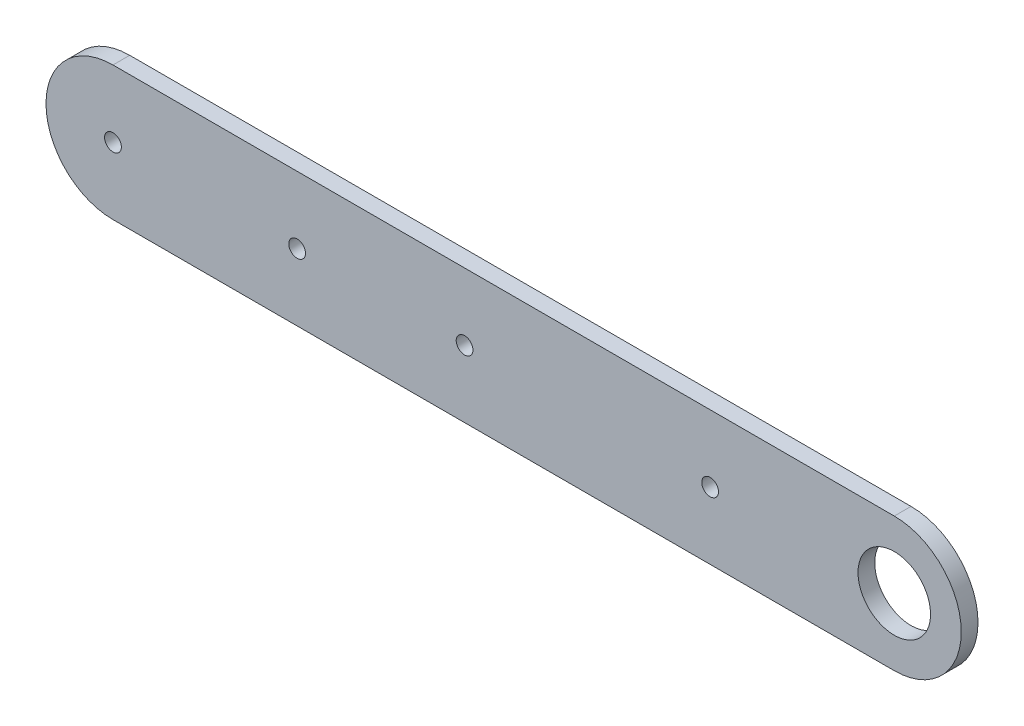
ISO-10303-21;
HEADER;
FILE_DESCRIPTION(('STEP AP214'),'2;1');
FILE_NAME('part.step','',(''),(''),'','','');
FILE_SCHEMA(('AUTOMOTIVE_DESIGN { 1 0 10303 214 1 1 1 1 }'));
ENDSEC;
DATA;
#1=APPLICATION_CONTEXT('core data for automotive mechanical design processes');
#2=APPLICATION_PROTOCOL_DEFINITION('international standard','automotive_design',2000,#1);
#3=PRODUCT_CONTEXT('',#1,'mechanical');
#4=PRODUCT('Part','Part','',(#3));
#5=PRODUCT_RELATED_PRODUCT_CATEGORY('part','',(#4));
#6=PRODUCT_DEFINITION_FORMATION('','',#4);
#7=PRODUCT_DEFINITION_CONTEXT('part definition',#1,'design');
#8=PRODUCT_DEFINITION('design','',#6,#7);
#9=PRODUCT_DEFINITION_SHAPE('','',#8);
#10=(LENGTH_UNIT() NAMED_UNIT(*) SI_UNIT(.MILLI.,.METRE.));
#11=(NAMED_UNIT(*) PLANE_ANGLE_UNIT() SI_UNIT($,.RADIAN.));
#12=(NAMED_UNIT(*) SI_UNIT($,.STERADIAN.) SOLID_ANGLE_UNIT());
#13=UNCERTAINTY_MEASURE_WITH_UNIT(LENGTH_MEASURE(1.E-05),#10,'distance_accuracy_value','');
#14=(GEOMETRIC_REPRESENTATION_CONTEXT(3) GLOBAL_UNCERTAINTY_ASSIGNED_CONTEXT((#13)) GLOBAL_UNIT_ASSIGNED_CONTEXT((#10,
#11,#12)) REPRESENTATION_CONTEXT('',''));
#15=CARTESIAN_POINT('',(0.,0.,0.));
#16=DIRECTION('',(0.,0.,1.));
#17=DIRECTION('',(1.,0.,0.));
#18=AXIS2_PLACEMENT_3D('',#15,#16,#17);
#19=CARTESIAN_POINT('',(-70.,0.,3.));
#20=DIRECTION('',(0.,0.,1.));
#21=DIRECTION('',(1.,0.,0.));
#22=AXIS2_PLACEMENT_3D('',#19,#20,#21);
#23=PLANE('',#22);
#24=CARTESIAN_POINT('',(-37.,0.,3.));
#25=DIRECTION('',(0.,0.,1.));
#26=DIRECTION('',(1.,0.,0.));
#27=AXIS2_PLACEMENT_3D('',#24,#25,#26);
#28=CIRCLE('',#27,1.5);
#29=CARTESIAN_POINT('',(-35.5,0.,3.));
#30=VERTEX_POINT('',#29);
#31=EDGE_CURVE('E127',#30,#30,#28,.T.);
#32=ORIENTED_EDGE('',*,*,#31,.F.);
#33=EDGE_LOOP('',(#32));
#34=FACE_BOUND('',#33,.T.);
#35=CARTESIAN_POINT('',(70.,0.,3.));
#36=DIRECTION('',(0.,0.,1.));
#37=DIRECTION('',(-1.,0.,0.));
#38=AXIS2_PLACEMENT_3D('',#35,#36,#37);
#39=CIRCLE('',#38,6.5);
#40=CARTESIAN_POINT('',(63.5,0.,3.));
#41=VERTEX_POINT('',#40);
#42=EDGE_CURVE('E115',#41,#41,#39,.T.);
#43=ORIENTED_EDGE('',*,*,#42,.F.);
#44=EDGE_LOOP('',(#43));
#45=FACE_BOUND('',#44,.T.);
#46=CARTESIAN_POINT('',(-70.,0.,3.));
#47=DIRECTION('',(0.,0.,1.));
#48=DIRECTION('',(1.,0.,0.));
#49=AXIS2_PLACEMENT_3D('',#46,#47,#48);
#50=CIRCLE('',#49,12.);
#51=CARTESIAN_POINT('',(-70.,12.,3.));
#52=VERTEX_POINT('',#51);
#53=CARTESIAN_POINT('',(-70.,-12.,3.));
#54=VERTEX_POINT('',#53);
#55=EDGE_CURVE('E85',#52,#54,#50,.T.);
#56=ORIENTED_EDGE('',*,*,#55,.T.);
#57=DIRECTION('',(1.,0.,0.));
#58=VECTOR('',#57,1.);
#59=CARTESIAN_POINT('',(-70.,-12.,3.));
#60=LINE('',#59,#58);
#61=CARTESIAN_POINT('',(70.,-12.,3.));
#62=VERTEX_POINT('',#61);
#63=EDGE_CURVE('E80',#54,#62,#60,.T.);
#64=ORIENTED_EDGE('',*,*,#63,.T.);
#65=CARTESIAN_POINT('',(70.,0.,3.));
#66=DIRECTION('',(0.,0.,1.));
#67=DIRECTION('',(-1.,0.,0.));
#68=AXIS2_PLACEMENT_3D('',#65,#66,#67);
#69=CIRCLE('',#68,12.);
#70=CARTESIAN_POINT('',(70.,12.,3.));
#71=VERTEX_POINT('',#70);
#72=EDGE_CURVE('E83',#62,#71,#69,.T.);
#73=ORIENTED_EDGE('',*,*,#72,.T.);
#74=DIRECTION('',(-1.,0.,0.));
#75=VECTOR('',#74,1.);
#76=CARTESIAN_POINT('',(-70.,12.,3.));
#77=LINE('',#76,#75);
#78=EDGE_CURVE('E50',#71,#52,#77,.T.);
#79=ORIENTED_EDGE('',*,*,#78,.T.);
#80=EDGE_LOOP('',(#56,#64,#73,#79));
#81=FACE_BOUND('',#80,.T.);
#82=CARTESIAN_POINT('',(-70.,0.,3.));
#83=DIRECTION('',(0.,0.,1.));
#84=DIRECTION('',(1.,0.,0.));
#85=AXIS2_PLACEMENT_3D('',#82,#83,#84);
#86=CIRCLE('',#85,1.5);
#87=CARTESIAN_POINT('',(-68.5,0.,3.));
#88=VERTEX_POINT('',#87);
#89=EDGE_CURVE('E100',#88,#88,#86,.T.);
#90=ORIENTED_EDGE('',*,*,#89,.F.);
#91=EDGE_LOOP('',(#90));
#92=FACE_BOUND('',#91,.T.);
#93=CARTESIAN_POINT('',(-7.,0.,3.));
#94=DIRECTION('',(0.,0.,1.));
#95=DIRECTION('',(1.,0.,0.));
#96=AXIS2_PLACEMENT_3D('',#93,#94,#95);
#97=CIRCLE('',#96,1.5);
#98=CARTESIAN_POINT('',(-5.5,0.,3.));
#99=VERTEX_POINT('',#98);
#100=EDGE_CURVE('E121',#99,#99,#97,.T.);
#101=ORIENTED_EDGE('',*,*,#100,.F.);
#102=EDGE_LOOP('',(#101));
#103=FACE_BOUND('',#102,.T.);
#104=CARTESIAN_POINT('',(37.,0.,3.));
#105=DIRECTION('',(0.,0.,1.));
#106=DIRECTION('',(1.,0.,0.));
#107=AXIS2_PLACEMENT_3D('',#104,#105,#106);
#108=CIRCLE('',#107,1.5);
#109=CARTESIAN_POINT('',(38.5,0.,3.));
#110=VERTEX_POINT('',#109);
#111=EDGE_CURVE('E133',#110,#110,#108,.T.);
#112=ORIENTED_EDGE('',*,*,#111,.F.);
#113=EDGE_LOOP('',(#112));
#114=FACE_BOUND('',#113,.T.);
#115=ADVANCED_FACE('F33',(#34,#45,#81,#92,#103,#114),#23,.T.);
#116=CARTESIAN_POINT('',(-70.,0.,0.));
#117=DIRECTION('',(0.,0.,1.));
#118=DIRECTION('',(1.,0.,0.));
#119=AXIS2_PLACEMENT_3D('',#116,#117,#118);
#120=PLANE('',#119);
#121=CARTESIAN_POINT('',(-70.,0.,0.));
#122=DIRECTION('',(0.,0.,1.));
#123=DIRECTION('',(1.,0.,0.));
#124=AXIS2_PLACEMENT_3D('',#121,#122,#123);
#125=CIRCLE('',#124,12.);
#126=CARTESIAN_POINT('',(-70.,12.,0.));
#127=VERTEX_POINT('',#126);
#128=CARTESIAN_POINT('',(-70.,-12.,0.));
#129=VERTEX_POINT('',#128);
#130=EDGE_CURVE('E97',#127,#129,#125,.T.);
#131=ORIENTED_EDGE('',*,*,#130,.F.);
#132=DIRECTION('',(-1.,0.,0.));
#133=VECTOR('',#132,1.);
#134=CARTESIAN_POINT('',(-70.,12.,0.));
#135=LINE('',#134,#133);
#136=CARTESIAN_POINT('',(70.,12.,0.));
#137=VERTEX_POINT('',#136);
#138=EDGE_CURVE('E73',#137,#127,#135,.T.);
#139=ORIENTED_EDGE('',*,*,#138,.F.);
#140=CARTESIAN_POINT('',(70.,0.,0.));
#141=DIRECTION('',(0.,0.,1.));
#142=DIRECTION('',(-1.,0.,0.));
#143=AXIS2_PLACEMENT_3D('',#140,#141,#142);
#144=CIRCLE('',#143,12.);
#145=CARTESIAN_POINT('',(70.,-12.,0.));
#146=VERTEX_POINT('',#145);
#147=EDGE_CURVE('E67',#146,#137,#144,.T.);
#148=ORIENTED_EDGE('',*,*,#147,.F.);
#149=DIRECTION('',(1.,0.,0.));
#150=VECTOR('',#149,1.);
#151=CARTESIAN_POINT('',(-70.,-12.,0.));
#152=LINE('',#151,#150);
#153=EDGE_CURVE('E89',#129,#146,#152,.T.);
#154=ORIENTED_EDGE('',*,*,#153,.F.);
#155=EDGE_LOOP('',(#131,#139,#148,#154));
#156=FACE_BOUND('',#155,.T.);
#157=CARTESIAN_POINT('',(-70.,0.,0.));
#158=DIRECTION('',(0.,0.,1.));
#159=DIRECTION('',(1.,0.,0.));
#160=AXIS2_PLACEMENT_3D('',#157,#158,#159);
#161=CIRCLE('',#160,1.5);
#162=CARTESIAN_POINT('',(-68.5,0.,0.));
#163=VERTEX_POINT('',#162);
#164=EDGE_CURVE('E112',#163,#163,#161,.T.);
#165=ORIENTED_EDGE('',*,*,#164,.T.);
#166=EDGE_LOOP('',(#165));
#167=FACE_BOUND('',#166,.T.);
#168=CARTESIAN_POINT('',(70.,0.,0.));
#169=DIRECTION('',(0.,0.,1.));
#170=DIRECTION('',(-1.,0.,0.));
#171=AXIS2_PLACEMENT_3D('',#168,#169,#170);
#172=CIRCLE('',#171,6.5);
#173=CARTESIAN_POINT('',(63.5,0.,0.));
#174=VERTEX_POINT('',#173);
#175=EDGE_CURVE('E118',#174,#174,#172,.T.);
#176=ORIENTED_EDGE('',*,*,#175,.T.);
#177=EDGE_LOOP('',(#176));
#178=FACE_BOUND('',#177,.T.);
#179=CARTESIAN_POINT('',(-7.,0.,0.));
#180=DIRECTION('',(0.,0.,1.));
#181=DIRECTION('',(1.,0.,0.));
#182=AXIS2_PLACEMENT_3D('',#179,#180,#181);
#183=CIRCLE('',#182,1.5);
#184=CARTESIAN_POINT('',(-5.5,0.,0.));
#185=VERTEX_POINT('',#184);
#186=EDGE_CURVE('E124',#185,#185,#183,.T.);
#187=ORIENTED_EDGE('',*,*,#186,.T.);
#188=EDGE_LOOP('',(#187));
#189=FACE_BOUND('',#188,.T.);
#190=CARTESIAN_POINT('',(-37.,0.,0.));
#191=DIRECTION('',(0.,0.,1.));
#192=DIRECTION('',(1.,0.,0.));
#193=AXIS2_PLACEMENT_3D('',#190,#191,#192);
#194=CIRCLE('',#193,1.5);
#195=CARTESIAN_POINT('',(-35.5,0.,0.));
#196=VERTEX_POINT('',#195);
#197=EDGE_CURVE('E130',#196,#196,#194,.T.);
#198=ORIENTED_EDGE('',*,*,#197,.T.);
#199=EDGE_LOOP('',(#198));
#200=FACE_BOUND('',#199,.T.);
#201=CARTESIAN_POINT('',(37.,0.,0.));
#202=DIRECTION('',(0.,0.,1.));
#203=DIRECTION('',(1.,0.,0.));
#204=AXIS2_PLACEMENT_3D('',#201,#202,#203);
#205=CIRCLE('',#204,1.5);
#206=CARTESIAN_POINT('',(38.5,0.,0.));
#207=VERTEX_POINT('',#206);
#208=EDGE_CURVE('E136',#207,#207,#205,.T.);
#209=ORIENTED_EDGE('',*,*,#208,.T.);
#210=EDGE_LOOP('',(#209));
#211=FACE_BOUND('',#210,.T.);
#212=ADVANCED_FACE('F108',(#156,#167,#178,#189,#200,#211),#120,.F.);
#213=CARTESIAN_POINT('',(-70.,0.,3.));
#214=DIRECTION('',(0.,0.,-1.));
#215=DIRECTION('',(-1.,0.,0.));
#216=AXIS2_PLACEMENT_3D('',#213,#214,#215);
#217=CYLINDRICAL_SURFACE('',#216,12.);
#218=ORIENTED_EDGE('',*,*,#130,.T.);
#219=DIRECTION('',(0.,0.,-1.));
#220=VECTOR('',#219,1.);
#221=CARTESIAN_POINT('',(-70.,-12.,3.));
#222=LINE('',#221,#220);
#223=EDGE_CURVE('E11',#54,#129,#222,.T.);
#224=ORIENTED_EDGE('',*,*,#223,.F.);
#225=ORIENTED_EDGE('',*,*,#55,.F.);
#226=DIRECTION('',(0.,0.,-1.));
#227=VECTOR('',#226,1.);
#228=CARTESIAN_POINT('',(-70.,12.,3.));
#229=LINE('',#228,#227);
#230=EDGE_CURVE('E93',#52,#127,#229,.T.);
#231=ORIENTED_EDGE('',*,*,#230,.T.);
#232=EDGE_LOOP('',(#218,#224,#225,#231));
#233=FACE_BOUND('',#232,.T.);
#234=ADVANCED_FACE('F35',(#233),#217,.T.);
#235=CARTESIAN_POINT('',(-70.,-12.,3.));
#236=DIRECTION('',(0.,1.,0.));
#237=DIRECTION('',(-1.,0.,0.));
#238=AXIS2_PLACEMENT_3D('',#235,#236,#237);
#239=PLANE('',#238);
#240=ORIENTED_EDGE('',*,*,#153,.T.);
#241=DIRECTION('',(0.,0.,-1.));
#242=VECTOR('',#241,1.);
#243=CARTESIAN_POINT('',(70.,-12.,3.));
#244=LINE('',#243,#242);
#245=EDGE_CURVE('E42',#62,#146,#244,.T.);
#246=ORIENTED_EDGE('',*,*,#245,.F.);
#247=ORIENTED_EDGE('',*,*,#63,.F.);
#248=ORIENTED_EDGE('',*,*,#223,.T.);
#249=EDGE_LOOP('',(#240,#246,#247,#248));
#250=FACE_BOUND('',#249,.T.);
#251=ADVANCED_FACE('F88',(#250),#239,.F.);
#252=CARTESIAN_POINT('',(70.,0.,3.));
#253=DIRECTION('',(0.,0.,-1.));
#254=DIRECTION('',(-1.,0.,0.));
#255=AXIS2_PLACEMENT_3D('',#252,#253,#254);
#256=CYLINDRICAL_SURFACE('',#255,12.);
#257=ORIENTED_EDGE('',*,*,#147,.T.);
#258=DIRECTION('',(0.,0.,-1.));
#259=VECTOR('',#258,1.);
#260=CARTESIAN_POINT('',(70.,12.,3.));
#261=LINE('',#260,#259);
#262=EDGE_CURVE('E90',#71,#137,#261,.T.);
#263=ORIENTED_EDGE('',*,*,#262,.F.);
#264=ORIENTED_EDGE('',*,*,#72,.F.);
#265=ORIENTED_EDGE('',*,*,#245,.T.);
#266=EDGE_LOOP('',(#257,#263,#264,#265));
#267=FACE_BOUND('',#266,.T.);
#268=ADVANCED_FACE('F91',(#267),#256,.T.);
#269=CARTESIAN_POINT('',(-70.,12.,3.));
#270=DIRECTION('',(0.,-1.,0.));
#271=DIRECTION('',(1.,0.,0.));
#272=AXIS2_PLACEMENT_3D('',#269,#270,#271);
#273=PLANE('',#272);
#274=ORIENTED_EDGE('',*,*,#138,.T.);
#275=ORIENTED_EDGE('',*,*,#230,.F.);
#276=ORIENTED_EDGE('',*,*,#78,.F.);
#277=ORIENTED_EDGE('',*,*,#262,.T.);
#278=EDGE_LOOP('',(#274,#275,#276,#277));
#279=FACE_BOUND('',#278,.T.);
#280=ADVANCED_FACE('F105',(#279),#273,.F.);
#281=CARTESIAN_POINT('',(-70.,0.,3.));
#282=DIRECTION('',(0.,0.,-1.));
#283=DIRECTION('',(-1.,0.,0.));
#284=AXIS2_PLACEMENT_3D('',#281,#282,#283);
#285=CYLINDRICAL_SURFACE('',#284,1.5);
#286=ORIENTED_EDGE('',*,*,#89,.T.);
#287=EDGE_LOOP('',(#286));
#288=FACE_BOUND('',#287,.T.);
#289=ORIENTED_EDGE('',*,*,#164,.F.);
#290=EDGE_LOOP('',(#289));
#291=FACE_BOUND('',#290,.T.);
#292=ADVANCED_FACE('F155',(#288,#291),#285,.F.);
#293=CARTESIAN_POINT('',(70.,0.,3.));
#294=DIRECTION('',(0.,0.,-1.));
#295=DIRECTION('',(-1.,0.,0.));
#296=AXIS2_PLACEMENT_3D('',#293,#294,#295);
#297=CYLINDRICAL_SURFACE('',#296,6.5);
#298=ORIENTED_EDGE('',*,*,#42,.T.);
#299=EDGE_LOOP('',(#298));
#300=FACE_BOUND('',#299,.T.);
#301=ORIENTED_EDGE('',*,*,#175,.F.);
#302=EDGE_LOOP('',(#301));
#303=FACE_BOUND('',#302,.T.);
#304=ADVANCED_FACE('F201',(#300,#303),#297,.F.);
#305=CARTESIAN_POINT('',(-7.,0.,3.));
#306=DIRECTION('',(0.,0.,-1.));
#307=DIRECTION('',(-1.,0.,0.));
#308=AXIS2_PLACEMENT_3D('',#305,#306,#307);
#309=CYLINDRICAL_SURFACE('',#308,1.5);
#310=ORIENTED_EDGE('',*,*,#100,.T.);
#311=EDGE_LOOP('',(#310));
#312=FACE_BOUND('',#311,.T.);
#313=ORIENTED_EDGE('',*,*,#186,.F.);
#314=EDGE_LOOP('',(#313));
#315=FACE_BOUND('',#314,.T.);
#316=ADVANCED_FACE('F209',(#312,#315),#309,.F.);
#317=CARTESIAN_POINT('',(-37.,0.,3.));
#318=DIRECTION('',(0.,0.,-1.));
#319=DIRECTION('',(-1.,0.,0.));
#320=AXIS2_PLACEMENT_3D('',#317,#318,#319);
#321=CYLINDRICAL_SURFACE('',#320,1.5);
#322=ORIENTED_EDGE('',*,*,#31,.T.);
#323=EDGE_LOOP('',(#322));
#324=FACE_BOUND('',#323,.T.);
#325=ORIENTED_EDGE('',*,*,#197,.F.);
#326=EDGE_LOOP('',(#325));
#327=FACE_BOUND('',#326,.T.);
#328=ADVANCED_FACE('F217',(#324,#327),#321,.F.);
#329=CARTESIAN_POINT('',(37.,0.,3.));
#330=DIRECTION('',(0.,0.,-1.));
#331=DIRECTION('',(-1.,0.,0.));
#332=AXIS2_PLACEMENT_3D('',#329,#330,#331);
#333=CYLINDRICAL_SURFACE('',#332,1.5);
#334=ORIENTED_EDGE('',*,*,#111,.T.);
#335=EDGE_LOOP('',(#334));
#336=FACE_BOUND('',#335,.T.);
#337=ORIENTED_EDGE('',*,*,#208,.F.);
#338=EDGE_LOOP('',(#337));
#339=FACE_BOUND('',#338,.T.);
#340=ADVANCED_FACE('F142',(#336,#339),#333,.F.);
#341=CLOSED_SHELL('',(#115,#212,#234,#251,#268,#280,#292,#304,#316,#328,#340));
#342=MANIFOLD_SOLID_BREP('B2',#341);
#343=ADVANCED_BREP_SHAPE_REPRESENTATION('',(#18,#342),#14);
#344=SHAPE_DEFINITION_REPRESENTATION(#9,#343);
ENDSEC;
END-ISO-10303-21;
